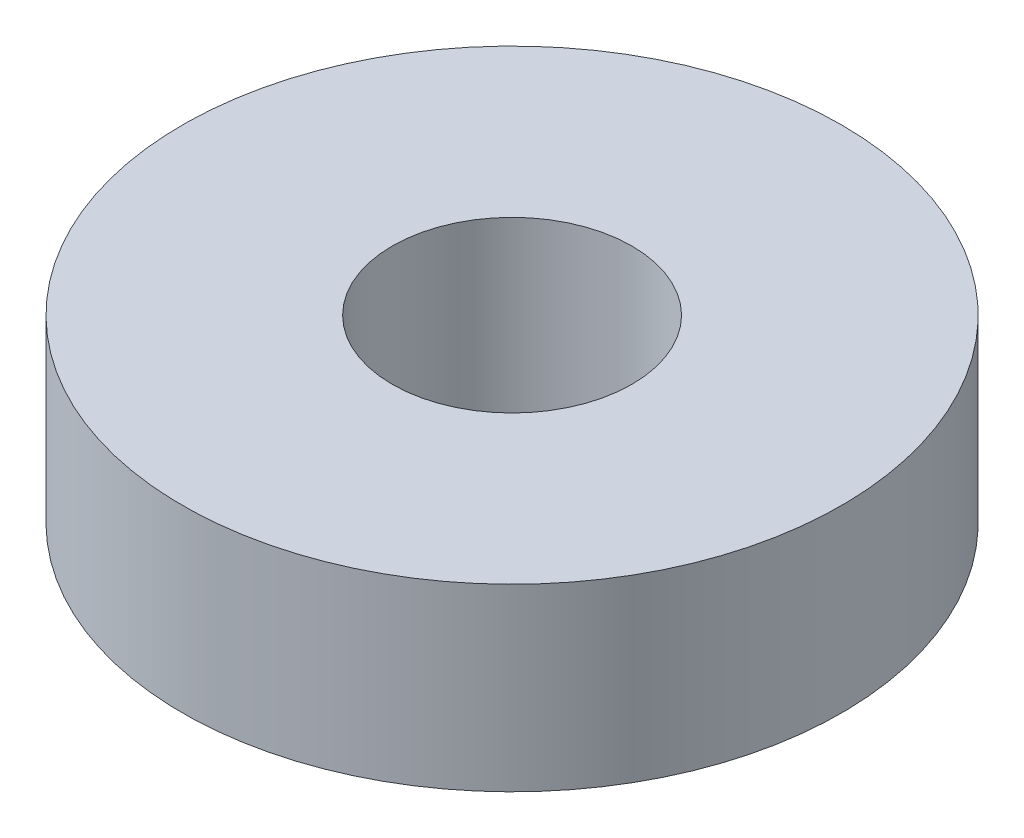
ISO-10303-21;
HEADER;
FILE_DESCRIPTION(('STEP AP214'),'2;1');
FILE_NAME('part.step','',(''),(''),'','','');
FILE_SCHEMA(('AUTOMOTIVE_DESIGN { 1 0 10303 214 1 1 1 1 }'));
ENDSEC;
DATA;
#1=APPLICATION_CONTEXT('core data for automotive mechanical design processes');
#2=APPLICATION_PROTOCOL_DEFINITION('international standard','automotive_design',2000,#1);
#3=PRODUCT_CONTEXT('',#1,'mechanical');
#4=PRODUCT('Part','Part','',(#3));
#5=PRODUCT_RELATED_PRODUCT_CATEGORY('part','',(#4));
#6=PRODUCT_DEFINITION_FORMATION('','',#4);
#7=PRODUCT_DEFINITION_CONTEXT('part definition',#1,'design');
#8=PRODUCT_DEFINITION('design','',#6,#7);
#9=PRODUCT_DEFINITION_SHAPE('','',#8);
#10=(LENGTH_UNIT() NAMED_UNIT(*) SI_UNIT(.MILLI.,.METRE.));
#11=(NAMED_UNIT(*) PLANE_ANGLE_UNIT() SI_UNIT($,.RADIAN.));
#12=(NAMED_UNIT(*) SI_UNIT($,.STERADIAN.) SOLID_ANGLE_UNIT());
#13=UNCERTAINTY_MEASURE_WITH_UNIT(LENGTH_MEASURE(1.E-05),#10,'distance_accuracy_value','');
#14=(GEOMETRIC_REPRESENTATION_CONTEXT(3) GLOBAL_UNCERTAINTY_ASSIGNED_CONTEXT((#13)) GLOBAL_UNIT_ASSIGNED_CONTEXT((#10,
#11,#12)) REPRESENTATION_CONTEXT('',''));
#15=CARTESIAN_POINT('',(0.,0.,0.));
#16=DIRECTION('',(0.,0.,1.));
#17=DIRECTION('',(1.,0.,0.));
#18=AXIS2_PLACEMENT_3D('',#15,#16,#17);
#19=CARTESIAN_POINT('',(0.,0.,0.));
#20=DIRECTION('',(0.,1.,0.));
#21=DIRECTION('',(0.,0.,1.));
#22=AXIS2_PLACEMENT_3D('',#19,#20,#21);
#23=PLANE('',#22);
#24=CARTESIAN_POINT('',(0.,0.,0.));
#25=DIRECTION('',(0.,-1.,0.));
#26=DIRECTION('',(0.,0.,-1.));
#27=AXIS2_PLACEMENT_3D('',#24,#25,#26);
#28=CIRCLE('',#27,2.);
#29=CARTESIAN_POINT('',(0.,0.,-2.));
#30=VERTEX_POINT('',#29);
#31=EDGE_CURVE('E28',#30,#30,#28,.F.);
#32=ORIENTED_EDGE('',*,*,#31,.T.);
#33=EDGE_LOOP('',(#32));
#34=FACE_BOUND('',#33,.T.);
#35=CARTESIAN_POINT('',(0.,0.,0.));
#36=DIRECTION('',(0.,-1.,0.));
#37=DIRECTION('',(0.,0.,-1.));
#38=AXIS2_PLACEMENT_3D('',#35,#36,#37);
#39=CIRCLE('',#38,5.5);
#40=CARTESIAN_POINT('',(0.,0.,-5.5));
#41=VERTEX_POINT('',#40);
#42=EDGE_CURVE('E19',#41,#41,#39,.F.);
#43=ORIENTED_EDGE('',*,*,#42,.F.);
#44=EDGE_LOOP('',(#43));
#45=FACE_BOUND('',#44,.T.);
#46=ADVANCED_FACE('F15',(#34,#45),#23,.F.);
#47=CARTESIAN_POINT('',(0.,3.,0.));
#48=DIRECTION('',(0.,-1.,0.));
#49=DIRECTION('',(0.,0.,-1.));
#50=AXIS2_PLACEMENT_3D('',#47,#48,#49);
#51=CYLINDRICAL_SURFACE('',#50,5.5);
#52=ORIENTED_EDGE('',*,*,#42,.T.);
#53=EDGE_LOOP('',(#52));
#54=FACE_BOUND('',#53,.T.);
#55=CARTESIAN_POINT('',(0.,3.,0.));
#56=DIRECTION('',(0.,-1.,0.));
#57=DIRECTION('',(0.,0.,-1.));
#58=AXIS2_PLACEMENT_3D('',#55,#56,#57);
#59=CIRCLE('',#58,5.5);
#60=CARTESIAN_POINT('',(0.,3.,-5.5));
#61=VERTEX_POINT('',#60);
#62=EDGE_CURVE('E23',#61,#61,#59,.F.);
#63=ORIENTED_EDGE('',*,*,#62,.F.);
#64=EDGE_LOOP('',(#63));
#65=FACE_BOUND('',#64,.T.);
#66=ADVANCED_FACE('F36',(#54,#65),#51,.T.);
#67=CARTESIAN_POINT('',(0.,3.,0.));
#68=DIRECTION('',(0.,-1.,0.));
#69=DIRECTION('',(0.,0.,-1.));
#70=AXIS2_PLACEMENT_3D('',#67,#68,#69);
#71=CYLINDRICAL_SURFACE('',#70,2.);
#72=CARTESIAN_POINT('',(0.,3.,0.));
#73=DIRECTION('',(0.,-1.,0.));
#74=DIRECTION('',(0.,0.,-1.));
#75=AXIS2_PLACEMENT_3D('',#72,#73,#74);
#76=CIRCLE('',#75,2.);
#77=CARTESIAN_POINT('',(0.,3.,-2.));
#78=VERTEX_POINT('',#77);
#79=EDGE_CURVE('E10',#78,#78,#76,.T.);
#80=ORIENTED_EDGE('',*,*,#79,.F.);
#81=EDGE_LOOP('',(#80));
#82=FACE_BOUND('',#81,.T.);
#83=ORIENTED_EDGE('',*,*,#31,.F.);
#84=EDGE_LOOP('',(#83));
#85=FACE_BOUND('',#84,.T.);
#86=ADVANCED_FACE('F45',(#82,#85),#71,.F.);
#87=CARTESIAN_POINT('',(0.,3.,0.));
#88=DIRECTION('',(0.,1.,0.));
#89=DIRECTION('',(0.,0.,1.));
#90=AXIS2_PLACEMENT_3D('',#87,#88,#89);
#91=PLANE('',#90);
#92=ORIENTED_EDGE('',*,*,#79,.T.);
#93=EDGE_LOOP('',(#92));
#94=FACE_BOUND('',#93,.T.);
#95=ORIENTED_EDGE('',*,*,#62,.T.);
#96=EDGE_LOOP('',(#95));
#97=FACE_BOUND('',#96,.T.);
#98=ADVANCED_FACE('F17',(#94,#97),#91,.T.);
#99=CLOSED_SHELL('',(#46,#66,#86,#98));
#100=MANIFOLD_SOLID_BREP('B1',#99);
#101=ADVANCED_BREP_SHAPE_REPRESENTATION('',(#18,#100),#14);
#102=SHAPE_DEFINITION_REPRESENTATION(#9,#101);
ENDSEC;
END-ISO-10303-21;
